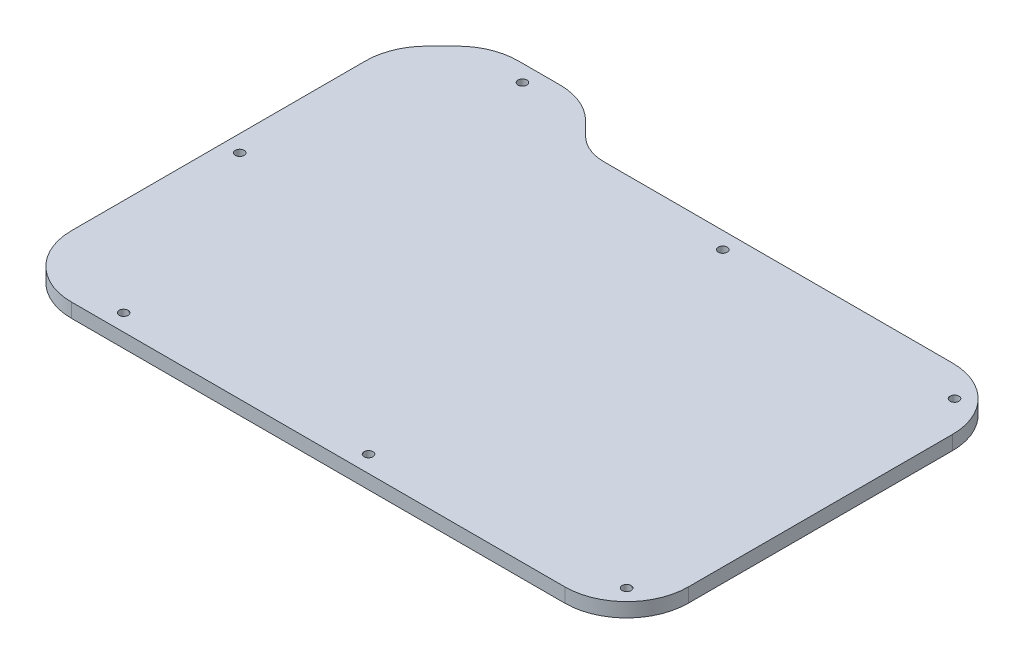
ISO-10303-21;
HEADER;
FILE_DESCRIPTION(('STEP AP214'),'2;1');
FILE_NAME('part.step','',(''),(''),'','','');
FILE_SCHEMA(('AUTOMOTIVE_DESIGN { 1 0 10303 214 1 1 1 1 }'));
ENDSEC;
DATA;
#1=APPLICATION_CONTEXT('core data for automotive mechanical design processes');
#2=APPLICATION_PROTOCOL_DEFINITION('international standard','automotive_design',2000,#1);
#3=PRODUCT_CONTEXT('',#1,'mechanical');
#4=PRODUCT('Part','Part','',(#3));
#5=PRODUCT_RELATED_PRODUCT_CATEGORY('part','',(#4));
#6=PRODUCT_DEFINITION_FORMATION('','',#4);
#7=PRODUCT_DEFINITION_CONTEXT('part definition',#1,'design');
#8=PRODUCT_DEFINITION('design','',#6,#7);
#9=PRODUCT_DEFINITION_SHAPE('','',#8);
#10=(LENGTH_UNIT() NAMED_UNIT(*) SI_UNIT(.MILLI.,.METRE.));
#11=(NAMED_UNIT(*) PLANE_ANGLE_UNIT() SI_UNIT($,.RADIAN.));
#12=(NAMED_UNIT(*) SI_UNIT($,.STERADIAN.) SOLID_ANGLE_UNIT());
#13=UNCERTAINTY_MEASURE_WITH_UNIT(LENGTH_MEASURE(1.E-05),#10,'distance_accuracy_value','');
#14=(GEOMETRIC_REPRESENTATION_CONTEXT(3) GLOBAL_UNCERTAINTY_ASSIGNED_CONTEXT((#13)) GLOBAL_UNIT_ASSIGNED_CONTEXT((#10,
#11,#12)) REPRESENTATION_CONTEXT('',''));
#15=CARTESIAN_POINT('',(0.,0.,0.));
#16=DIRECTION('',(0.,0.,1.));
#17=DIRECTION('',(1.,0.,0.));
#18=AXIS2_PLACEMENT_3D('',#15,#16,#17);
#19=CARTESIAN_POINT('',(-254.403734696646,3.175,101.056878234369));
#20=DIRECTION('',(0.,1.,0.));
#21=DIRECTION('',(0.,0.,1.));
#22=AXIS2_PLACEMENT_3D('',#19,#20,#21);
#23=PLANE('',#22);
#24=CARTESIAN_POINT('',(-136.527115839683,3.175,174.218400603284));
#25=DIRECTION('',(0.,1.,0.));
#26=DIRECTION('',(0.,0.,1.));
#27=AXIS2_PLACEMENT_3D('',#24,#25,#26);
#28=CIRCLE('',#27,0.999999999999998);
#29=CARTESIAN_POINT('',(-136.527115839683,3.175,175.218400603284));
#30=VERTEX_POINT('',#29);
#31=EDGE_CURVE('E331',#30,#30,#28,.T.);
#32=ORIENTED_EDGE('',*,*,#31,.F.);
#33=EDGE_LOOP('',(#32));
#34=FACE_BOUND('',#33,.T.);
#35=CARTESIAN_POINT('',(-191.484546698451,3.175,97.6766221132999));
#36=DIRECTION('',(0.,1.,0.));
#37=DIRECTION('',(0.,0.,1.));
#38=AXIS2_PLACEMENT_3D('',#35,#36,#37);
#39=CIRCLE('',#38,0.999999999999998);
#40=CARTESIAN_POINT('',(-191.484546698451,3.175,98.6766221132999));
#41=VERTEX_POINT('',#40);
#42=EDGE_CURVE('E343',#41,#41,#39,.T.);
#43=ORIENTED_EDGE('',*,*,#42,.F.);
#44=EDGE_LOOP('',(#43));
#45=FACE_BOUND('',#44,.T.);
#46=CARTESIAN_POINT('',(-264.503734696646,3.175,133.066750173834));
#47=DIRECTION('',(0.,1.,0.));
#48=DIRECTION('',(0.,0.,1.));
#49=AXIS2_PLACEMENT_3D('',#46,#47,#48);
#50=CIRCLE('',#49,1.00000000000005);
#51=CARTESIAN_POINT('',(-264.503734696646,3.175,134.066750173835));
#52=VERTEX_POINT('',#51);
#53=EDGE_CURVE('E355',#52,#52,#50,.T.);
#54=ORIENTED_EDGE('',*,*,#53,.F.);
#55=EDGE_LOOP('',(#54));
#56=FACE_BOUND('',#55,.T.);
#57=CARTESIAN_POINT('',(-254.403734696646,3.175,101.056878234369));
#58=DIRECTION('',(0.,1.,0.));
#59=DIRECTION('',(0.,0.,1.));
#60=AXIS2_PLACEMENT_3D('',#57,#58,#59);
#61=CIRCLE('',#60,13.85);
#62=CARTESIAN_POINT('',(-264.197163616079,3.175,91.2634493149354));
#63=VERTEX_POINT('',#62);
#64=CARTESIAN_POINT('',(-268.253734696646,3.175,101.056878234369));
#65=VERTEX_POINT('',#64);
#66=EDGE_CURVE('E195',#63,#65,#61,.T.);
#67=ORIENTED_EDGE('',*,*,#66,.T.);
#68=DIRECTION('',(0.,0.,1.));
#69=VECTOR('',#68,1.);
#70=CARTESIAN_POINT('',(-268.253734696646,3.175,101.056878234369));
#71=LINE('',#70,#69);
#72=CARTESIAN_POINT('',(-268.253734696646,3.175,167.0766221133));
#73=VERTEX_POINT('',#72);
#74=EDGE_CURVE('E113',#65,#73,#71,.T.);
#75=ORIENTED_EDGE('',*,*,#74,.T.);
#76=CARTESIAN_POINT('',(-254.403734696646,3.175,167.0766221133));
#77=DIRECTION('',(0.,1.,0.));
#78=DIRECTION('',(0.,0.,1.));
#79=AXIS2_PLACEMENT_3D('',#76,#77,#78);
#80=CIRCLE('',#79,13.85);
#81=CARTESIAN_POINT('',(-254.403734696646,3.175,180.9266221133));
#82=VERTEX_POINT('',#81);
#83=EDGE_CURVE('E228',#73,#82,#80,.T.);
#84=ORIENTED_EDGE('',*,*,#83,.T.);
#85=DIRECTION('',(1.,0.,0.));
#86=VECTOR('',#85,1.);
#87=CARTESIAN_POINT('',(-254.403734696646,3.175,180.9266221133));
#88=LINE('',#87,#86);
#89=CARTESIAN_POINT('',(-143.668894329667,3.175,180.9266221133));
#90=VERTEX_POINT('',#89);
#91=EDGE_CURVE('E247',#82,#90,#88,.T.);
#92=ORIENTED_EDGE('',*,*,#91,.T.);
#93=CARTESIAN_POINT('',(-143.668894329667,3.175,167.0766221133));
#94=DIRECTION('',(0.,1.,0.));
#95=DIRECTION('',(0.,0.,1.));
#96=AXIS2_PLACEMENT_3D('',#93,#94,#95);
#97=CIRCLE('',#96,13.85);
#98=CARTESIAN_POINT('',(-129.818894329667,3.175,167.0766221133));
#99=VERTEX_POINT('',#98);
#100=EDGE_CURVE('E244',#90,#99,#97,.T.);
#101=ORIENTED_EDGE('',*,*,#100,.T.);
#102=DIRECTION('',(0.,0.,-1.));
#103=VECTOR('',#102,1.);
#104=CARTESIAN_POINT('',(-129.818894329667,3.175,167.0766221133));
#105=LINE('',#104,#103);
#106=CARTESIAN_POINT('',(-129.818894329667,3.175,107.7766221133));
#107=VERTEX_POINT('',#106);
#108=EDGE_CURVE('E246',#99,#107,#105,.T.);
#109=ORIENTED_EDGE('',*,*,#108,.T.);
#110=CARTESIAN_POINT('',(-143.668894329667,3.175,107.7766221133));
#111=DIRECTION('',(0.,1.,0.));
#112=DIRECTION('',(0.,0.,1.));
#113=AXIS2_PLACEMENT_3D('',#110,#111,#112);
#114=CIRCLE('',#113,13.85);
#115=CARTESIAN_POINT('',(-143.668894329667,3.175,93.9266221132999));
#116=VERTEX_POINT('',#115);
#117=EDGE_CURVE('E249',#107,#116,#114,.T.);
#118=ORIENTED_EDGE('',*,*,#117,.T.);
#119=DIRECTION('',(-1.,0.,0.));
#120=VECTOR('',#119,1.);
#121=CARTESIAN_POINT('',(-143.668894329667,3.175,93.9266221132999));
#122=LINE('',#121,#120);
#123=CARTESIAN_POINT('',(-221.881483076265,3.175,93.9266221132999));
#124=VERTEX_POINT('',#123);
#125=EDGE_CURVE('E255',#116,#124,#122,.T.);
#126=ORIENTED_EDGE('',*,*,#125,.T.);
#127=CARTESIAN_POINT('',(-221.881483076265,3.175,83.9266221132999));
#128=DIRECTION('',(0.,-1.,0.));
#129=DIRECTION('',(0.,0.,-1.));
#130=AXIS2_PLACEMENT_3D('',#127,#128,#129);
#131=CIRCLE('',#130,10.);
#132=CARTESIAN_POINT('',(-228.952550888131,3.175,90.9976899251654));
#133=VERTEX_POINT('',#132);
#134=EDGE_CURVE('E257',#124,#133,#131,.T.);
#135=ORIENTED_EDGE('',*,*,#134,.T.);
#136=DIRECTION('',(-0.707106781186547,0.,-0.707106781186547));
#137=VECTOR('',#136,1.);
#138=CARTESIAN_POINT('',(-231.96704761943,3.175,87.9831931938663));
#139=LINE('',#138,#137);
#140=CARTESIAN_POINT('',(-231.96704761943,3.175,87.9831931938663));
#141=VERTEX_POINT('',#140);
#142=EDGE_CURVE('E259',#133,#141,#139,.T.);
#143=ORIENTED_EDGE('',*,*,#142,.T.);
#144=CARTESIAN_POINT('',(-241.760476538863,3.175,97.7766221132999));
#145=DIRECTION('',(0.,1.,0.));
#146=DIRECTION('',(0.,0.,1.));
#147=AXIS2_PLACEMENT_3D('',#144,#145,#146);
#148=CIRCLE('',#147,13.85);
#149=CARTESIAN_POINT('',(-241.760476538863,3.175,83.9266221132999));
#150=VERTEX_POINT('',#149);
#151=EDGE_CURVE('E150',#141,#150,#148,.T.);
#152=ORIENTED_EDGE('',*,*,#151,.T.);
#153=DIRECTION('',(-1.,0.,0.));
#154=VECTOR('',#153,1.);
#155=CARTESIAN_POINT('',(-241.760476538863,3.175,83.9266221132999));
#156=LINE('',#155,#154);
#157=CARTESIAN_POINT('',(-251.123478575577,3.175,83.9266221132999));
#158=VERTEX_POINT('',#157);
#159=EDGE_CURVE('E144',#150,#158,#156,.T.);
#160=ORIENTED_EDGE('',*,*,#159,.T.);
#161=CARTESIAN_POINT('',(-251.123478575577,3.175,97.7766221132999));
#162=DIRECTION('',(0.,1.,0.));
#163=DIRECTION('',(0.,0.,1.));
#164=AXIS2_PLACEMENT_3D('',#161,#162,#163);
#165=CIRCLE('',#164,13.85);
#166=CARTESIAN_POINT('',(-260.91690749501,3.175,87.9831931938663));
#167=VERTEX_POINT('',#166);
#168=EDGE_CURVE('E148',#158,#167,#165,.T.);
#169=ORIENTED_EDGE('',*,*,#168,.T.);
#170=DIRECTION('',(-0.707106781186545,0.,0.70710678118655));
#171=VECTOR('',#170,1.);
#172=CARTESIAN_POINT('',(-260.91690749501,3.175,87.9831931938662));
#173=LINE('',#172,#171);
#174=EDGE_CURVE('E52',#167,#63,#173,.T.);
#175=ORIENTED_EDGE('',*,*,#174,.T.);
#176=EDGE_LOOP('',(#67,#75,#84,#92,#101,#109,#118,#126,#135,#143,#152,#160,#169,#175));
#177=FACE_BOUND('',#176,.T.);
#178=CARTESIAN_POINT('',(-246.44197755722,3.175,177.1766221133));
#179=DIRECTION('',(0.,1.,0.));
#180=DIRECTION('',(0.,0.,1.));
#181=AXIS2_PLACEMENT_3D('',#178,#179,#180);
#182=CIRCLE('',#181,1.00000000000002);
#183=CARTESIAN_POINT('',(-246.44197755722,3.175,178.1766221133));
#184=VERTEX_POINT('',#183);
#185=EDGE_CURVE('E172',#184,#184,#182,.T.);
#186=ORIENTED_EDGE('',*,*,#185,.F.);
#187=EDGE_LOOP('',(#186));
#188=FACE_BOUND('',#187,.T.);
#189=CARTESIAN_POINT('',(-246.44197755722,3.175,87.6766221132999));
#190=DIRECTION('',(0.,1.,0.));
#191=DIRECTION('',(0.,0.,1.));
#192=AXIS2_PLACEMENT_3D('',#189,#190,#191);
#193=CIRCLE('',#192,0.999999999999998);
#194=CARTESIAN_POINT('',(-246.44197755722,3.175,88.6766221132999));
#195=VERTEX_POINT('',#194);
#196=EDGE_CURVE('E349',#195,#195,#193,.T.);
#197=ORIENTED_EDGE('',*,*,#196,.F.);
#198=EDGE_LOOP('',(#197));
#199=FACE_BOUND('',#198,.T.);
#200=CARTESIAN_POINT('',(-136.527115839683,3.175,100.634843623316));
#201=DIRECTION('',(0.,1.,0.));
#202=DIRECTION('',(0.,0.,1.));
#203=AXIS2_PLACEMENT_3D('',#200,#201,#202);
#204=CIRCLE('',#203,0.999999999999998);
#205=CARTESIAN_POINT('',(-136.527115839683,3.175,101.634843623316));
#206=VERTEX_POINT('',#205);
#207=EDGE_CURVE('E337',#206,#206,#204,.T.);
#208=ORIENTED_EDGE('',*,*,#207,.F.);
#209=EDGE_LOOP('',(#208));
#210=FACE_BOUND('',#209,.T.);
#211=CARTESIAN_POINT('',(-191.484546698451,3.175,177.1766221133));
#212=DIRECTION('',(0.,1.,0.));
#213=DIRECTION('',(0.,0.,1.));
#214=AXIS2_PLACEMENT_3D('',#211,#212,#213);
#215=CIRCLE('',#214,0.999999999999998);
#216=CARTESIAN_POINT('',(-191.484546698451,3.175,178.1766221133));
#217=VERTEX_POINT('',#216);
#218=EDGE_CURVE('E322',#217,#217,#215,.T.);
#219=ORIENTED_EDGE('',*,*,#218,.F.);
#220=EDGE_LOOP('',(#219));
#221=FACE_BOUND('',#220,.T.);
#222=ADVANCED_FACE('F35',(#34,#45,#56,#177,#188,#199,#210,#221),#23,.T.);
#223=CARTESIAN_POINT('',(-254.403734696646,0.,101.056878234369));
#224=DIRECTION('',(0.,1.,0.));
#225=DIRECTION('',(0.,0.,1.));
#226=AXIS2_PLACEMENT_3D('',#223,#224,#225);
#227=PLANE('',#226);
#228=CARTESIAN_POINT('',(-254.403734696646,0.,101.056878234369));
#229=DIRECTION('',(0.,1.,0.));
#230=DIRECTION('',(0.,0.,1.));
#231=AXIS2_PLACEMENT_3D('',#228,#229,#230);
#232=CIRCLE('',#231,13.85);
#233=CARTESIAN_POINT('',(-264.197163616079,0.,91.2634493149354));
#234=VERTEX_POINT('',#233);
#235=CARTESIAN_POINT('',(-268.253734696646,0.,101.056878234369));
#236=VERTEX_POINT('',#235);
#237=EDGE_CURVE('E168',#234,#236,#232,.T.);
#238=ORIENTED_EDGE('',*,*,#237,.F.);
#239=DIRECTION('',(-0.707106781186545,0.,0.70710678118655));
#240=VECTOR('',#239,1.);
#241=CARTESIAN_POINT('',(-260.91690749501,0.,87.9831931938662));
#242=LINE('',#241,#240);
#243=CARTESIAN_POINT('',(-260.91690749501,0.,87.9831931938663));
#244=VERTEX_POINT('',#243);
#245=EDGE_CURVE('E105',#244,#234,#242,.T.);
#246=ORIENTED_EDGE('',*,*,#245,.F.);
#247=CARTESIAN_POINT('',(-251.123478575577,0.,97.7766221132999));
#248=DIRECTION('',(0.,1.,0.));
#249=DIRECTION('',(0.,0.,1.));
#250=AXIS2_PLACEMENT_3D('',#247,#248,#249);
#251=CIRCLE('',#250,13.85);
#252=CARTESIAN_POINT('',(-251.123478575577,0.,83.9266221132999));
#253=VERTEX_POINT('',#252);
#254=EDGE_CURVE('E99',#253,#244,#251,.T.);
#255=ORIENTED_EDGE('',*,*,#254,.F.);
#256=DIRECTION('',(-1.,0.,0.));
#257=VECTOR('',#256,1.);
#258=CARTESIAN_POINT('',(-241.760476538863,0.,83.9266221132999));
#259=LINE('',#258,#257);
#260=CARTESIAN_POINT('',(-241.760476538863,0.,83.9266221132999));
#261=VERTEX_POINT('',#260);
#262=EDGE_CURVE('E158',#261,#253,#259,.T.);
#263=ORIENTED_EDGE('',*,*,#262,.F.);
#264=CARTESIAN_POINT('',(-241.760476538863,0.,97.7766221132999));
#265=DIRECTION('',(0.,1.,0.));
#266=DIRECTION('',(0.,0.,1.));
#267=AXIS2_PLACEMENT_3D('',#264,#265,#266);
#268=CIRCLE('',#267,13.85);
#269=CARTESIAN_POINT('',(-231.96704761943,0.,87.9831931938663));
#270=VERTEX_POINT('',#269);
#271=EDGE_CURVE('E190',#270,#261,#268,.T.);
#272=ORIENTED_EDGE('',*,*,#271,.F.);
#273=DIRECTION('',(-0.707106781186547,0.,-0.707106781186547));
#274=VECTOR('',#273,1.);
#275=CARTESIAN_POINT('',(-231.96704761943,0.,87.9831931938663));
#276=LINE('',#275,#274);
#277=CARTESIAN_POINT('',(-228.952550888131,0.,90.9976899251654));
#278=VERTEX_POINT('',#277);
#279=EDGE_CURVE('E188',#278,#270,#276,.T.);
#280=ORIENTED_EDGE('',*,*,#279,.F.);
#281=CARTESIAN_POINT('',(-221.881483076265,0.,83.9266221132999));
#282=DIRECTION('',(0.,-1.,0.));
#283=DIRECTION('',(0.,0.,-1.));
#284=AXIS2_PLACEMENT_3D('',#281,#282,#283);
#285=CIRCLE('',#284,10.);
#286=CARTESIAN_POINT('',(-221.881483076265,0.,93.9266221132999));
#287=VERTEX_POINT('',#286);
#288=EDGE_CURVE('E186',#287,#278,#285,.T.);
#289=ORIENTED_EDGE('',*,*,#288,.F.);
#290=DIRECTION('',(-1.,0.,0.));
#291=VECTOR('',#290,1.);
#292=CARTESIAN_POINT('',(-143.668894329667,0.,93.9266221132999));
#293=LINE('',#292,#291);
#294=CARTESIAN_POINT('',(-143.668894329667,0.,93.9266221132999));
#295=VERTEX_POINT('',#294);
#296=EDGE_CURVE('E184',#295,#287,#293,.T.);
#297=ORIENTED_EDGE('',*,*,#296,.F.);
#298=CARTESIAN_POINT('',(-143.668894329667,0.,107.7766221133));
#299=DIRECTION('',(0.,1.,0.));
#300=DIRECTION('',(0.,0.,1.));
#301=AXIS2_PLACEMENT_3D('',#298,#299,#300);
#302=CIRCLE('',#301,13.85);
#303=CARTESIAN_POINT('',(-129.818894329667,0.,107.7766221133));
#304=VERTEX_POINT('',#303);
#305=EDGE_CURVE('E182',#304,#295,#302,.T.);
#306=ORIENTED_EDGE('',*,*,#305,.F.);
#307=DIRECTION('',(0.,0.,-1.));
#308=VECTOR('',#307,1.);
#309=CARTESIAN_POINT('',(-129.818894329667,0.,167.0766221133));
#310=LINE('',#309,#308);
#311=CARTESIAN_POINT('',(-129.818894329667,0.,167.0766221133));
#312=VERTEX_POINT('',#311);
#313=EDGE_CURVE('E180',#312,#304,#310,.T.);
#314=ORIENTED_EDGE('',*,*,#313,.F.);
#315=CARTESIAN_POINT('',(-143.668894329667,0.,167.0766221133));
#316=DIRECTION('',(0.,1.,0.));
#317=DIRECTION('',(0.,0.,1.));
#318=AXIS2_PLACEMENT_3D('',#315,#316,#317);
#319=CIRCLE('',#318,13.85);
#320=CARTESIAN_POINT('',(-143.668894329667,0.,180.9266221133));
#321=VERTEX_POINT('',#320);
#322=EDGE_CURVE('E178',#321,#312,#319,.T.);
#323=ORIENTED_EDGE('',*,*,#322,.F.);
#324=DIRECTION('',(1.,0.,0.));
#325=VECTOR('',#324,1.);
#326=CARTESIAN_POINT('',(-254.403734696646,0.,180.9266221133));
#327=LINE('',#326,#325);
#328=CARTESIAN_POINT('',(-254.403734696646,0.,180.9266221133));
#329=VERTEX_POINT('',#328);
#330=EDGE_CURVE('E176',#329,#321,#327,.T.);
#331=ORIENTED_EDGE('',*,*,#330,.F.);
#332=CARTESIAN_POINT('',(-254.403734696646,0.,167.0766221133));
#333=DIRECTION('',(0.,1.,0.));
#334=DIRECTION('',(0.,0.,1.));
#335=AXIS2_PLACEMENT_3D('',#332,#333,#334);
#336=CIRCLE('',#335,13.85);
#337=CARTESIAN_POINT('',(-268.253734696646,0.,167.0766221133));
#338=VERTEX_POINT('',#337);
#339=EDGE_CURVE('E174',#338,#329,#336,.T.);
#340=ORIENTED_EDGE('',*,*,#339,.F.);
#341=DIRECTION('',(0.,0.,1.));
#342=VECTOR('',#341,1.);
#343=CARTESIAN_POINT('',(-268.253734696646,0.,101.056878234369));
#344=LINE('',#343,#342);
#345=EDGE_CURVE('E171',#236,#338,#344,.T.);
#346=ORIENTED_EDGE('',*,*,#345,.F.);
#347=EDGE_LOOP('',(#238,#246,#255,#263,#272,#280,#289,#297,#306,#314,#323,#331,#340,#346));
#348=FACE_BOUND('',#347,.T.);
#349=CARTESIAN_POINT('',(-246.44197755722,0.,177.1766221133));
#350=DIRECTION('',(0.,1.,0.));
#351=DIRECTION('',(0.,0.,1.));
#352=AXIS2_PLACEMENT_3D('',#349,#350,#351);
#353=CIRCLE('',#352,1.00000000000002);
#354=CARTESIAN_POINT('',(-246.44197755722,0.,178.1766221133));
#355=VERTEX_POINT('',#354);
#356=EDGE_CURVE('E358',#355,#355,#353,.T.);
#357=ORIENTED_EDGE('',*,*,#356,.T.);
#358=EDGE_LOOP('',(#357));
#359=FACE_BOUND('',#358,.T.);
#360=CARTESIAN_POINT('',(-264.503734696646,0.,133.066750173834));
#361=DIRECTION('',(0.,1.,0.));
#362=DIRECTION('',(0.,0.,1.));
#363=AXIS2_PLACEMENT_3D('',#360,#361,#362);
#364=CIRCLE('',#363,1.00000000000005);
#365=CARTESIAN_POINT('',(-264.503734696646,0.,134.066750173835));
#366=VERTEX_POINT('',#365);
#367=EDGE_CURVE('E352',#366,#366,#364,.T.);
#368=ORIENTED_EDGE('',*,*,#367,.T.);
#369=EDGE_LOOP('',(#368));
#370=FACE_BOUND('',#369,.T.);
#371=CARTESIAN_POINT('',(-246.44197755722,0.,87.6766221132999));
#372=DIRECTION('',(0.,1.,0.));
#373=DIRECTION('',(0.,0.,1.));
#374=AXIS2_PLACEMENT_3D('',#371,#372,#373);
#375=CIRCLE('',#374,0.999999999999998);
#376=CARTESIAN_POINT('',(-246.44197755722,0.,88.6766221132999));
#377=VERTEX_POINT('',#376);
#378=EDGE_CURVE('E346',#377,#377,#375,.T.);
#379=ORIENTED_EDGE('',*,*,#378,.T.);
#380=EDGE_LOOP('',(#379));
#381=FACE_BOUND('',#380,.T.);
#382=CARTESIAN_POINT('',(-191.484546698451,0.,97.6766221132999));
#383=DIRECTION('',(0.,1.,0.));
#384=DIRECTION('',(0.,0.,1.));
#385=AXIS2_PLACEMENT_3D('',#382,#383,#384);
#386=CIRCLE('',#385,0.999999999999998);
#387=CARTESIAN_POINT('',(-191.484546698451,0.,98.6766221132999));
#388=VERTEX_POINT('',#387);
#389=EDGE_CURVE('E340',#388,#388,#386,.T.);
#390=ORIENTED_EDGE('',*,*,#389,.T.);
#391=EDGE_LOOP('',(#390));
#392=FACE_BOUND('',#391,.T.);
#393=CARTESIAN_POINT('',(-136.527115839683,0.,100.634843623316));
#394=DIRECTION('',(0.,1.,0.));
#395=DIRECTION('',(0.,0.,1.));
#396=AXIS2_PLACEMENT_3D('',#393,#394,#395);
#397=CIRCLE('',#396,0.999999999999998);
#398=CARTESIAN_POINT('',(-136.527115839683,0.,101.634843623316));
#399=VERTEX_POINT('',#398);
#400=EDGE_CURVE('E334',#399,#399,#397,.T.);
#401=ORIENTED_EDGE('',*,*,#400,.T.);
#402=EDGE_LOOP('',(#401));
#403=FACE_BOUND('',#402,.T.);
#404=CARTESIAN_POINT('',(-136.527115839683,0.,174.218400603284));
#405=DIRECTION('',(0.,1.,0.));
#406=DIRECTION('',(0.,0.,1.));
#407=AXIS2_PLACEMENT_3D('',#404,#405,#406);
#408=CIRCLE('',#407,0.999999999999998);
#409=CARTESIAN_POINT('',(-136.527115839683,0.,175.218400603284));
#410=VERTEX_POINT('',#409);
#411=EDGE_CURVE('E328',#410,#410,#408,.T.);
#412=ORIENTED_EDGE('',*,*,#411,.T.);
#413=EDGE_LOOP('',(#412));
#414=FACE_BOUND('',#413,.T.);
#415=CARTESIAN_POINT('',(-191.484546698451,0.,177.1766221133));
#416=DIRECTION('',(0.,1.,0.));
#417=DIRECTION('',(0.,0.,1.));
#418=AXIS2_PLACEMENT_3D('',#415,#416,#417);
#419=CIRCLE('',#418,0.999999999999998);
#420=CARTESIAN_POINT('',(-191.484546698451,0.,178.1766221133));
#421=VERTEX_POINT('',#420);
#422=EDGE_CURVE('E325',#421,#421,#419,.T.);
#423=ORIENTED_EDGE('',*,*,#422,.T.);
#424=EDGE_LOOP('',(#423));
#425=FACE_BOUND('',#424,.T.);
#426=ADVANCED_FACE('F232',(#348,#359,#370,#381,#392,#403,#414,#425),#227,.F.);
#427=CARTESIAN_POINT('',(-254.403734696646,3.175,101.056878234369));
#428=DIRECTION('',(0.,-1.,0.));
#429=DIRECTION('',(0.,0.,-1.));
#430=AXIS2_PLACEMENT_3D('',#427,#428,#429);
#431=CYLINDRICAL_SURFACE('',#430,13.85);
#432=ORIENTED_EDGE('',*,*,#237,.T.);
#433=DIRECTION('',(0.,-1.,0.));
#434=VECTOR('',#433,1.);
#435=CARTESIAN_POINT('',(-268.253734696646,3.175,101.056878234369));
#436=LINE('',#435,#434);
#437=EDGE_CURVE('E11',#65,#236,#436,.T.);
#438=ORIENTED_EDGE('',*,*,#437,.F.);
#439=ORIENTED_EDGE('',*,*,#66,.F.);
#440=DIRECTION('',(0.,-1.,0.));
#441=VECTOR('',#440,1.);
#442=CARTESIAN_POINT('',(-264.197163616079,3.175,91.2634493149354));
#443=LINE('',#442,#441);
#444=EDGE_CURVE('E164',#63,#234,#443,.T.);
#445=ORIENTED_EDGE('',*,*,#444,.T.);
#446=EDGE_LOOP('',(#432,#438,#439,#445));
#447=FACE_BOUND('',#446,.T.);
#448=ADVANCED_FACE('F37',(#447),#431,.T.);
#449=CARTESIAN_POINT('',(-268.253734696646,3.175,101.056878234369));
#450=DIRECTION('',(1.,0.,0.));
#451=DIRECTION('',(0.,0.,-1.));
#452=AXIS2_PLACEMENT_3D('',#449,#450,#451);
#453=PLANE('',#452);
#454=ORIENTED_EDGE('',*,*,#345,.T.);
#455=DIRECTION('',(0.,-1.,0.));
#456=VECTOR('',#455,1.);
#457=CARTESIAN_POINT('',(-268.253734696646,3.175,167.0766221133));
#458=LINE('',#457,#456);
#459=EDGE_CURVE('E44',#73,#338,#458,.T.);
#460=ORIENTED_EDGE('',*,*,#459,.F.);
#461=ORIENTED_EDGE('',*,*,#74,.F.);
#462=ORIENTED_EDGE('',*,*,#437,.T.);
#463=EDGE_LOOP('',(#454,#460,#461,#462));
#464=FACE_BOUND('',#463,.T.);
#465=ADVANCED_FACE('F515',(#464),#453,.F.);
#466=CARTESIAN_POINT('',(-254.403734696646,3.175,167.0766221133));
#467=DIRECTION('',(0.,-1.,0.));
#468=DIRECTION('',(0.,0.,-1.));
#469=AXIS2_PLACEMENT_3D('',#466,#467,#468);
#470=CYLINDRICAL_SURFACE('',#469,13.85);
#471=ORIENTED_EDGE('',*,*,#339,.T.);
#472=DIRECTION('',(0.,-1.,0.));
#473=VECTOR('',#472,1.);
#474=CARTESIAN_POINT('',(-254.403734696646,3.175,180.9266221133));
#475=LINE('',#474,#473);
#476=EDGE_CURVE('E220',#82,#329,#475,.T.);
#477=ORIENTED_EDGE('',*,*,#476,.F.);
#478=ORIENTED_EDGE('',*,*,#83,.F.);
#479=ORIENTED_EDGE('',*,*,#459,.T.);
#480=EDGE_LOOP('',(#471,#477,#478,#479));
#481=FACE_BOUND('',#480,.T.);
#482=ADVANCED_FACE('F226',(#481),#470,.T.);
#483=CARTESIAN_POINT('',(-254.403734696646,3.175,180.9266221133));
#484=DIRECTION('',(0.,0.,-1.));
#485=DIRECTION('',(-1.,0.,0.));
#486=AXIS2_PLACEMENT_3D('',#483,#484,#485);
#487=PLANE('',#486);
#488=ORIENTED_EDGE('',*,*,#330,.T.);
#489=DIRECTION('',(0.,-1.,0.));
#490=VECTOR('',#489,1.);
#491=CARTESIAN_POINT('',(-143.668894329667,3.175,180.9266221133));
#492=LINE('',#491,#490);
#493=EDGE_CURVE('E217',#90,#321,#492,.T.);
#494=ORIENTED_EDGE('',*,*,#493,.F.);
#495=ORIENTED_EDGE('',*,*,#91,.F.);
#496=ORIENTED_EDGE('',*,*,#476,.T.);
#497=EDGE_LOOP('',(#488,#494,#495,#496));
#498=FACE_BOUND('',#497,.T.);
#499=ADVANCED_FACE('F238',(#498),#487,.F.);
#500=CARTESIAN_POINT('',(-143.668894329667,3.175,167.0766221133));
#501=DIRECTION('',(0.,-1.,0.));
#502=DIRECTION('',(0.,0.,-1.));
#503=AXIS2_PLACEMENT_3D('',#500,#501,#502);
#504=CYLINDRICAL_SURFACE('',#503,13.85);
#505=ORIENTED_EDGE('',*,*,#322,.T.);
#506=DIRECTION('',(0.,-1.,0.));
#507=VECTOR('',#506,1.);
#508=CARTESIAN_POINT('',(-129.818894329667,3.175,167.0766221133));
#509=LINE('',#508,#507);
#510=EDGE_CURVE('E214',#99,#312,#509,.T.);
#511=ORIENTED_EDGE('',*,*,#510,.F.);
#512=ORIENTED_EDGE('',*,*,#100,.F.);
#513=ORIENTED_EDGE('',*,*,#493,.T.);
#514=EDGE_LOOP('',(#505,#511,#512,#513));
#515=FACE_BOUND('',#514,.T.);
#516=ADVANCED_FACE('F242',(#515),#504,.T.);
#517=CARTESIAN_POINT('',(-129.818894329667,3.175,167.0766221133));
#518=DIRECTION('',(-1.,0.,0.));
#519=DIRECTION('',(0.,0.,1.));
#520=AXIS2_PLACEMENT_3D('',#517,#518,#519);
#521=PLANE('',#520);
#522=ORIENTED_EDGE('',*,*,#313,.T.);
#523=DIRECTION('',(0.,-1.,0.));
#524=VECTOR('',#523,1.);
#525=CARTESIAN_POINT('',(-129.818894329667,3.175,107.7766221133));
#526=LINE('',#525,#524);
#527=EDGE_CURVE('E211',#107,#304,#526,.T.);
#528=ORIENTED_EDGE('',*,*,#527,.F.);
#529=ORIENTED_EDGE('',*,*,#108,.F.);
#530=ORIENTED_EDGE('',*,*,#510,.T.);
#531=EDGE_LOOP('',(#522,#528,#529,#530));
#532=FACE_BOUND('',#531,.T.);
#533=ADVANCED_FACE('F480',(#532),#521,.F.);
#534=CARTESIAN_POINT('',(-143.668894329667,3.175,107.7766221133));
#535=DIRECTION('',(0.,-1.,0.));
#536=DIRECTION('',(0.,0.,-1.));
#537=AXIS2_PLACEMENT_3D('',#534,#535,#536);
#538=CYLINDRICAL_SURFACE('',#537,13.85);
#539=ORIENTED_EDGE('',*,*,#305,.T.);
#540=DIRECTION('',(0.,-1.,0.));
#541=VECTOR('',#540,1.);
#542=CARTESIAN_POINT('',(-143.668894329667,3.175,93.9266221132999));
#543=LINE('',#542,#541);
#544=EDGE_CURVE('E208',#116,#295,#543,.T.);
#545=ORIENTED_EDGE('',*,*,#544,.F.);
#546=ORIENTED_EDGE('',*,*,#117,.F.);
#547=ORIENTED_EDGE('',*,*,#527,.T.);
#548=EDGE_LOOP('',(#539,#545,#546,#547));
#549=FACE_BOUND('',#548,.T.);
#550=ADVANCED_FACE('F470',(#549),#538,.T.);
#551=CARTESIAN_POINT('',(-143.668894329667,3.175,93.9266221132999));
#552=DIRECTION('',(0.,0.,1.));
#553=DIRECTION('',(1.,0.,0.));
#554=AXIS2_PLACEMENT_3D('',#551,#552,#553);
#555=PLANE('',#554);
#556=ORIENTED_EDGE('',*,*,#296,.T.);
#557=DIRECTION('',(0.,-1.,0.));
#558=VECTOR('',#557,1.);
#559=CARTESIAN_POINT('',(-221.881483076265,3.175,93.9266221132999));
#560=LINE('',#559,#558);
#561=EDGE_CURVE('E205',#124,#287,#560,.T.);
#562=ORIENTED_EDGE('',*,*,#561,.F.);
#563=ORIENTED_EDGE('',*,*,#125,.F.);
#564=ORIENTED_EDGE('',*,*,#544,.T.);
#565=EDGE_LOOP('',(#556,#562,#563,#564));
#566=FACE_BOUND('',#565,.T.);
#567=ADVANCED_FACE('F460',(#566),#555,.F.);
#568=CARTESIAN_POINT('',(-221.881483076265,3.175,83.9266221132999));
#569=DIRECTION('',(0.,-1.,0.));
#570=DIRECTION('',(0.,0.,-1.));
#571=AXIS2_PLACEMENT_3D('',#568,#569,#570);
#572=CYLINDRICAL_SURFACE('',#571,10.);
#573=ORIENTED_EDGE('',*,*,#288,.T.);
#574=DIRECTION('',(0.,-1.,0.));
#575=VECTOR('',#574,1.);
#576=CARTESIAN_POINT('',(-228.952550888131,3.175,90.9976899251654));
#577=LINE('',#576,#575);
#578=EDGE_CURVE('E202',#133,#278,#577,.T.);
#579=ORIENTED_EDGE('',*,*,#578,.F.);
#580=ORIENTED_EDGE('',*,*,#134,.F.);
#581=ORIENTED_EDGE('',*,*,#561,.T.);
#582=EDGE_LOOP('',(#573,#579,#580,#581));
#583=FACE_BOUND('',#582,.T.);
#584=ADVANCED_FACE('F451',(#583),#572,.F.);
#585=CARTESIAN_POINT('',(-231.96704761943,3.175,87.9831931938663));
#586=DIRECTION('',(-0.707106781186548,0.,0.707106781186548));
#587=DIRECTION('',(0.707106781186548,0.,0.707106781186548));
#588=AXIS2_PLACEMENT_3D('',#585,#586,#587);
#589=PLANE('',#588);
#590=ORIENTED_EDGE('',*,*,#279,.T.);
#591=DIRECTION('',(0.,-1.,0.));
#592=VECTOR('',#591,1.);
#593=CARTESIAN_POINT('',(-231.96704761943,3.175,87.9831931938663));
#594=LINE('',#593,#592);
#595=EDGE_CURVE('E199',#141,#270,#594,.T.);
#596=ORIENTED_EDGE('',*,*,#595,.F.);
#597=ORIENTED_EDGE('',*,*,#142,.F.);
#598=ORIENTED_EDGE('',*,*,#578,.T.);
#599=EDGE_LOOP('',(#590,#596,#597,#598));
#600=FACE_BOUND('',#599,.T.);
#601=ADVANCED_FACE('F265',(#600),#589,.F.);
#602=CARTESIAN_POINT('',(-241.760476538863,3.175,97.7766221132999));
#603=DIRECTION('',(0.,-1.,0.));
#604=DIRECTION('',(0.,0.,-1.));
#605=AXIS2_PLACEMENT_3D('',#602,#603,#604);
#606=CYLINDRICAL_SURFACE('',#605,13.85);
#607=ORIENTED_EDGE('',*,*,#271,.T.);
#608=DIRECTION('',(0.,-1.,0.));
#609=VECTOR('',#608,1.);
#610=CARTESIAN_POINT('',(-241.760476538863,3.175,83.9266221132999));
#611=LINE('',#610,#609);
#612=EDGE_CURVE('E159',#150,#261,#611,.T.);
#613=ORIENTED_EDGE('',*,*,#612,.F.);
#614=ORIENTED_EDGE('',*,*,#151,.F.);
#615=ORIENTED_EDGE('',*,*,#595,.T.);
#616=EDGE_LOOP('',(#607,#613,#614,#615));
#617=FACE_BOUND('',#616,.T.);
#618=ADVANCED_FACE('F269',(#617),#606,.T.);
#619=CARTESIAN_POINT('',(-241.760476538863,3.175,83.9266221132999));
#620=DIRECTION('',(0.,0.,1.));
#621=DIRECTION('',(1.,0.,0.));
#622=AXIS2_PLACEMENT_3D('',#619,#620,#621);
#623=PLANE('',#622);
#624=ORIENTED_EDGE('',*,*,#262,.T.);
#625=DIRECTION('',(0.,-1.,0.));
#626=VECTOR('',#625,1.);
#627=CARTESIAN_POINT('',(-251.123478575577,3.175,83.9266221132999));
#628=LINE('',#627,#626);
#629=EDGE_CURVE('E155',#158,#253,#628,.T.);
#630=ORIENTED_EDGE('',*,*,#629,.F.);
#631=ORIENTED_EDGE('',*,*,#159,.F.);
#632=ORIENTED_EDGE('',*,*,#612,.T.);
#633=EDGE_LOOP('',(#624,#630,#631,#632));
#634=FACE_BOUND('',#633,.T.);
#635=ADVANCED_FACE('F156',(#634),#623,.F.);
#636=CARTESIAN_POINT('',(-251.123478575577,3.175,97.7766221132999));
#637=DIRECTION('',(0.,-1.,0.));
#638=DIRECTION('',(0.,0.,-1.));
#639=AXIS2_PLACEMENT_3D('',#636,#637,#638);
#640=CYLINDRICAL_SURFACE('',#639,13.85);
#641=ORIENTED_EDGE('',*,*,#254,.T.);
#642=DIRECTION('',(0.,-1.,0.));
#643=VECTOR('',#642,1.);
#644=CARTESIAN_POINT('',(-260.91690749501,3.175,87.9831931938663));
#645=LINE('',#644,#643);
#646=EDGE_CURVE('E160',#167,#244,#645,.T.);
#647=ORIENTED_EDGE('',*,*,#646,.F.);
#648=ORIENTED_EDGE('',*,*,#168,.F.);
#649=ORIENTED_EDGE('',*,*,#629,.T.);
#650=EDGE_LOOP('',(#641,#647,#648,#649));
#651=FACE_BOUND('',#650,.T.);
#652=ADVANCED_FACE('F162',(#651),#640,.T.);
#653=CARTESIAN_POINT('',(-260.91690749501,3.175,87.9831931938662));
#654=DIRECTION('',(0.70710678118655,0.,0.707106781186545));
#655=DIRECTION('',(0.707106781186545,0.,-0.70710678118655));
#656=AXIS2_PLACEMENT_3D('',#653,#654,#655);
#657=PLANE('',#656);
#658=ORIENTED_EDGE('',*,*,#245,.T.);
#659=ORIENTED_EDGE('',*,*,#444,.F.);
#660=ORIENTED_EDGE('',*,*,#174,.F.);
#661=ORIENTED_EDGE('',*,*,#646,.T.);
#662=EDGE_LOOP('',(#658,#659,#660,#661));
#663=FACE_BOUND('',#662,.T.);
#664=ADVANCED_FACE('F273',(#663),#657,.F.);
#665=CARTESIAN_POINT('',(-246.44197755722,3.175,177.1766221133));
#666=DIRECTION('',(0.,-1.,0.));
#667=DIRECTION('',(0.,0.,-1.));
#668=AXIS2_PLACEMENT_3D('',#665,#666,#667);
#669=CYLINDRICAL_SURFACE('',#668,1.00000000000002);
#670=ORIENTED_EDGE('',*,*,#185,.T.);
#671=EDGE_LOOP('',(#670));
#672=FACE_BOUND('',#671,.T.);
#673=ORIENTED_EDGE('',*,*,#356,.F.);
#674=EDGE_LOOP('',(#673));
#675=FACE_BOUND('',#674,.T.);
#676=ADVANCED_FACE('F275',(#672,#675),#669,.F.);
#677=CARTESIAN_POINT('',(-264.503734696646,3.175,133.066750173834));
#678=DIRECTION('',(0.,-1.,0.));
#679=DIRECTION('',(0.,0.,-1.));
#680=AXIS2_PLACEMENT_3D('',#677,#678,#679);
#681=CYLINDRICAL_SURFACE('',#680,1.00000000000005);
#682=ORIENTED_EDGE('',*,*,#53,.T.);
#683=EDGE_LOOP('',(#682));
#684=FACE_BOUND('',#683,.T.);
#685=ORIENTED_EDGE('',*,*,#367,.F.);
#686=EDGE_LOOP('',(#685));
#687=FACE_BOUND('',#686,.T.);
#688=ADVANCED_FACE('F281',(#684,#687),#681,.F.);
#689=CARTESIAN_POINT('',(-246.44197755722,3.175,87.6766221132999));
#690=DIRECTION('',(0.,-1.,0.));
#691=DIRECTION('',(0.,0.,-1.));
#692=AXIS2_PLACEMENT_3D('',#689,#690,#691);
#693=CYLINDRICAL_SURFACE('',#692,0.999999999999998);
#694=ORIENTED_EDGE('',*,*,#196,.T.);
#695=EDGE_LOOP('',(#694));
#696=FACE_BOUND('',#695,.T.);
#697=ORIENTED_EDGE('',*,*,#378,.F.);
#698=EDGE_LOOP('',(#697));
#699=FACE_BOUND('',#698,.T.);
#700=ADVANCED_FACE('F297',(#696,#699),#693,.F.);
#701=CARTESIAN_POINT('',(-191.484546698451,3.175,97.6766221132999));
#702=DIRECTION('',(0.,-1.,0.));
#703=DIRECTION('',(0.,0.,-1.));
#704=AXIS2_PLACEMENT_3D('',#701,#702,#703);
#705=CYLINDRICAL_SURFACE('',#704,0.999999999999998);
#706=ORIENTED_EDGE('',*,*,#42,.T.);
#707=EDGE_LOOP('',(#706));
#708=FACE_BOUND('',#707,.T.);
#709=ORIENTED_EDGE('',*,*,#389,.F.);
#710=EDGE_LOOP('',(#709));
#711=FACE_BOUND('',#710,.T.);
#712=ADVANCED_FACE('F301',(#708,#711),#705,.F.);
#713=CARTESIAN_POINT('',(-136.527115839683,3.175,100.634843623316));
#714=DIRECTION('',(0.,-1.,0.));
#715=DIRECTION('',(0.,0.,-1.));
#716=AXIS2_PLACEMENT_3D('',#713,#714,#715);
#717=CYLINDRICAL_SURFACE('',#716,0.999999999999998);
#718=ORIENTED_EDGE('',*,*,#207,.T.);
#719=EDGE_LOOP('',(#718));
#720=FACE_BOUND('',#719,.T.);
#721=ORIENTED_EDGE('',*,*,#400,.F.);
#722=EDGE_LOOP('',(#721));
#723=FACE_BOUND('',#722,.T.);
#724=ADVANCED_FACE('F305',(#720,#723),#717,.F.);
#725=CARTESIAN_POINT('',(-136.527115839683,3.175,174.218400603284));
#726=DIRECTION('',(0.,-1.,0.));
#727=DIRECTION('',(0.,0.,-1.));
#728=AXIS2_PLACEMENT_3D('',#725,#726,#727);
#729=CYLINDRICAL_SURFACE('',#728,0.999999999999998);
#730=ORIENTED_EDGE('',*,*,#31,.T.);
#731=EDGE_LOOP('',(#730));
#732=FACE_BOUND('',#731,.T.);
#733=ORIENTED_EDGE('',*,*,#411,.F.);
#734=EDGE_LOOP('',(#733));
#735=FACE_BOUND('',#734,.T.);
#736=ADVANCED_FACE('F309',(#732,#735),#729,.F.);
#737=CARTESIAN_POINT('',(-191.484546698451,3.175,177.1766221133));
#738=DIRECTION('',(0.,-1.,0.));
#739=DIRECTION('',(0.,0.,-1.));
#740=AXIS2_PLACEMENT_3D('',#737,#738,#739);
#741=CYLINDRICAL_SURFACE('',#740,0.999999999999998);
#742=ORIENTED_EDGE('',*,*,#218,.T.);
#743=EDGE_LOOP('',(#742));
#744=FACE_BOUND('',#743,.T.);
#745=ORIENTED_EDGE('',*,*,#422,.F.);
#746=EDGE_LOOP('',(#745));
#747=FACE_BOUND('',#746,.T.);
#748=ADVANCED_FACE('F313',(#744,#747),#741,.F.);
#749=CLOSED_SHELL('',(#222,#426,#448,#465,#482,#499,#516,#533,#550,#567,#584,#601,#618,#635,
#652,#664,#676,#688,#700,#712,#724,#736,#748));
#750=MANIFOLD_SOLID_BREP('B2',#749);
#751=ADVANCED_BREP_SHAPE_REPRESENTATION('',(#18,#750),#14);
#752=SHAPE_DEFINITION_REPRESENTATION(#9,#751);
ENDSEC;
END-ISO-10303-21;
